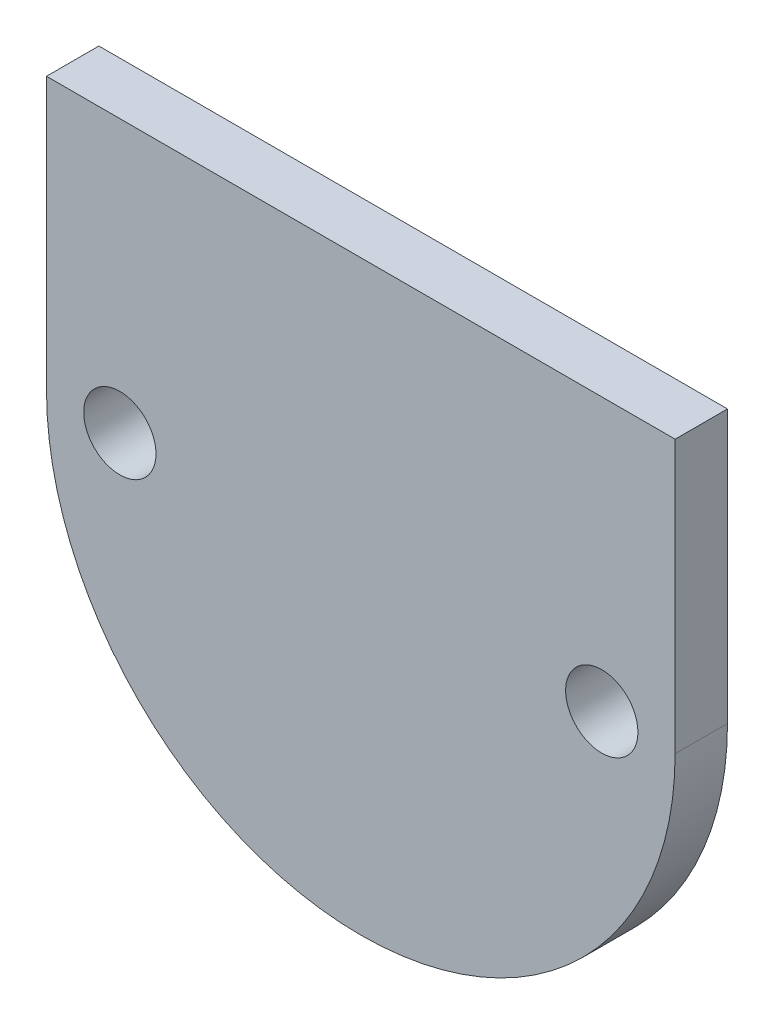
ISO-10303-21;
HEADER;
FILE_DESCRIPTION(('STEP AP214'),'2;1');
FILE_NAME('part.step','',(''),(''),'','','');
FILE_SCHEMA(('AUTOMOTIVE_DESIGN { 1 0 10303 214 1 1 1 1 }'));
ENDSEC;
DATA;
#1=APPLICATION_CONTEXT('core data for automotive mechanical design processes');
#2=APPLICATION_PROTOCOL_DEFINITION('international standard','automotive_design',2000,#1);
#3=PRODUCT_CONTEXT('',#1,'mechanical');
#4=PRODUCT('Part','Part','',(#3));
#5=PRODUCT_RELATED_PRODUCT_CATEGORY('part','',(#4));
#6=PRODUCT_DEFINITION_FORMATION('','',#4);
#7=PRODUCT_DEFINITION_CONTEXT('part definition',#1,'design');
#8=PRODUCT_DEFINITION('design','',#6,#7);
#9=PRODUCT_DEFINITION_SHAPE('','',#8);
#10=(LENGTH_UNIT() NAMED_UNIT(*) SI_UNIT(.MILLI.,.METRE.));
#11=(NAMED_UNIT(*) PLANE_ANGLE_UNIT() SI_UNIT($,.RADIAN.));
#12=(NAMED_UNIT(*) SI_UNIT($,.STERADIAN.) SOLID_ANGLE_UNIT());
#13=UNCERTAINTY_MEASURE_WITH_UNIT(LENGTH_MEASURE(1.E-05),#10,'distance_accuracy_value','');
#14=(GEOMETRIC_REPRESENTATION_CONTEXT(3) GLOBAL_UNCERTAINTY_ASSIGNED_CONTEXT((#13)) GLOBAL_UNIT_ASSIGNED_CONTEXT((#10,
#11,#12)) REPRESENTATION_CONTEXT('',''));
#15=CARTESIAN_POINT('',(0.,0.,0.));
#16=DIRECTION('',(0.,0.,1.));
#17=DIRECTION('',(1.,0.,0.));
#18=AXIS2_PLACEMENT_3D('',#15,#16,#17);
#19=CARTESIAN_POINT('',(-146.475088035676,41.618102884009,616.100036621094));
#20=DIRECTION('',(0.,0.,1.));
#21=DIRECTION('',(1.,0.,0.));
#22=AXIS2_PLACEMENT_3D('',#19,#20,#21);
#23=CYLINDRICAL_SURFACE('',#22,8.);
#24=CARTESIAN_POINT('',(-146.475088035676,41.618102884009,615.100036621094));
#25=DIRECTION('',(0.,0.,-1.));
#26=DIRECTION('',(1.,0.,0.));
#27=AXIS2_PLACEMENT_3D('',#24,#25,#26);
#28=CIRCLE('',#27,8.);
#29=CARTESIAN_POINT('',(-138.475088035676,41.618102884009,615.100036621094));
#30=VERTEX_POINT('',#29);
#31=EDGE_CURVE('E10',#30,#30,#28,.T.);
#32=ORIENTED_EDGE('',*,*,#31,.F.);
#33=EDGE_LOOP('',(#32));
#34=FACE_BOUND('',#33,.T.);
#35=CARTESIAN_POINT('',(-146.475088035676,41.618102884009,617.100036621094));
#36=DIRECTION('',(0.,0.,1.));
#37=DIRECTION('',(1.,0.,0.));
#38=AXIS2_PLACEMENT_3D('',#35,#36,#37);
#39=CIRCLE('',#38,8.);
#40=CARTESIAN_POINT('',(-138.475088035676,41.618102884009,617.100036621094));
#41=VERTEX_POINT('',#40);
#42=EDGE_CURVE('E25',#41,#41,#39,.T.);
#43=ORIENTED_EDGE('',*,*,#42,.F.);
#44=EDGE_LOOP('',(#43));
#45=FACE_BOUND('',#44,.T.);
#46=ADVANCED_FACE('F15',(#34,#45),#23,.T.);
#47=CARTESIAN_POINT('',(-146.475088035676,41.618102884009,615.100036621094));
#48=DIRECTION('',(0.,0.,-1.));
#49=DIRECTION('',(-1.,0.,0.));
#50=AXIS2_PLACEMENT_3D('',#47,#48,#49);
#51=PLANE('',#50);
#52=ORIENTED_EDGE('',*,*,#31,.T.);
#53=EDGE_LOOP('',(#52));
#54=FACE_BOUND('',#53,.T.);
#55=ADVANCED_FACE('F116',(#54),#51,.T.);
#56=CARTESIAN_POINT('',(-157.975088035676,41.2248544872213,622.350000977516));
#57=DIRECTION('',(0.,0.,-1.));
#58=DIRECTION('',(1.,0.,0.));
#59=AXIS2_PLACEMENT_3D('',#56,#57,#58);
#60=CYLINDRICAL_SURFACE('',#59,1.725);
#61=CARTESIAN_POINT('',(-157.975088035676,41.2248544872213,617.100036621094));
#62=DIRECTION('',(0.,0.,1.));
#63=DIRECTION('',(1.,0.,0.));
#64=AXIS2_PLACEMENT_3D('',#61,#62,#63);
#65=CIRCLE('',#64,1.725);
#66=CARTESIAN_POINT('',(-156.250088035676,41.2248544872213,617.100036621094));
#67=VERTEX_POINT('',#66);
#68=EDGE_CURVE('E102',#67,#67,#65,.T.);
#69=ORIENTED_EDGE('',*,*,#68,.F.);
#70=EDGE_LOOP('',(#69));
#71=FACE_BOUND('',#70,.T.);
#72=CARTESIAN_POINT('',(-157.975088035676,41.2248544872213,619.600000977516));
#73=DIRECTION('',(0.,0.,-1.));
#74=DIRECTION('',(1.,0.,0.));
#75=AXIS2_PLACEMENT_3D('',#72,#73,#74);
#76=CIRCLE('',#75,1.725);
#77=CARTESIAN_POINT('',(-156.250088035676,41.2248544872213,619.600000977516));
#78=VERTEX_POINT('',#77);
#79=EDGE_CURVE('E89',#78,#78,#76,.T.);
#80=ORIENTED_EDGE('',*,*,#79,.F.);
#81=EDGE_LOOP('',(#80));
#82=FACE_BOUND('',#81,.T.);
#83=ADVANCED_FACE('F124',(#71,#82),#60,.F.);
#84=CARTESIAN_POINT('',(-134.975088035676,41.2248544872213,623.849990844727));
#85=DIRECTION('',(0.,0.,1.));
#86=DIRECTION('',(1.,0.,0.));
#87=AXIS2_PLACEMENT_3D('',#84,#85,#86);
#88=CYLINDRICAL_SURFACE('',#87,1.725);
#89=CARTESIAN_POINT('',(-134.975088035676,41.2248544872213,617.100036621094));
#90=DIRECTION('',(0.,0.,1.));
#91=DIRECTION('',(1.,0.,0.));
#92=AXIS2_PLACEMENT_3D('',#89,#90,#91);
#93=CIRCLE('',#92,1.725);
#94=CARTESIAN_POINT('',(-133.250088035676,41.2248544872213,617.100036621094));
#95=VERTEX_POINT('',#94);
#96=EDGE_CURVE('E97',#95,#95,#93,.T.);
#97=ORIENTED_EDGE('',*,*,#96,.F.);
#98=EDGE_LOOP('',(#97));
#99=FACE_BOUND('',#98,.T.);
#100=CARTESIAN_POINT('',(-134.975088035676,41.2248544872213,619.600000977516));
#101=DIRECTION('',(0.,0.,-1.));
#102=DIRECTION('',(1.,0.,0.));
#103=AXIS2_PLACEMENT_3D('',#100,#101,#102);
#104=CIRCLE('',#103,1.725);
#105=CARTESIAN_POINT('',(-133.250088035676,41.2248544872213,619.600000977516));
#106=VERTEX_POINT('',#105);
#107=EDGE_CURVE('E87',#106,#106,#104,.T.);
#108=ORIENTED_EDGE('',*,*,#107,.F.);
#109=EDGE_LOOP('',(#108));
#110=FACE_BOUND('',#109,.T.);
#111=ADVANCED_FACE('F131',(#99,#110),#88,.F.);
#112=CARTESIAN_POINT('',(-146.475088035676,41.2248544872213,617.100036621094));
#113=DIRECTION('',(0.,0.,-1.));
#114=DIRECTION('',(1.,0.,0.));
#115=AXIS2_PLACEMENT_3D('',#112,#113,#114);
#116=PLANE('',#115);
#117=ORIENTED_EDGE('',*,*,#42,.T.);
#118=EDGE_LOOP('',(#117));
#119=FACE_BOUND('',#118,.T.);
#120=ORIENTED_EDGE('',*,*,#68,.T.);
#121=EDGE_LOOP('',(#120));
#122=FACE_BOUND('',#121,.T.);
#123=ORIENTED_EDGE('',*,*,#96,.T.);
#124=EDGE_LOOP('',(#123));
#125=FACE_BOUND('',#124,.T.);
#126=DIRECTION('',(-1.,0.,0.));
#127=VECTOR('',#126,1.);
#128=CARTESIAN_POINT('',(-146.475088035676,54.2248544872214,617.100036621094));
#129=LINE('',#128,#127);
#130=CARTESIAN_POINT('',(-131.475088035676,54.2248544872214,617.100036621094));
#131=VERTEX_POINT('',#130);
#132=CARTESIAN_POINT('',(-161.475088035676,54.2248544872214,617.100036621094));
#133=VERTEX_POINT('',#132);
#134=EDGE_CURVE('E34',#131,#133,#129,.T.);
#135=ORIENTED_EDGE('',*,*,#134,.F.);
#136=DIRECTION('',(0.,1.,0.));
#137=VECTOR('',#136,1.);
#138=CARTESIAN_POINT('',(-131.475088035676,44.4748544872213,617.100036621094));
#139=LINE('',#138,#137);
#140=CARTESIAN_POINT('',(-131.475088035676,41.2248544872213,617.100036621094));
#141=VERTEX_POINT('',#140);
#142=EDGE_CURVE('E76',#141,#131,#139,.T.);
#143=ORIENTED_EDGE('',*,*,#142,.F.);
#144=CARTESIAN_POINT('',(-146.475088035676,41.2248544872213,617.100036621094));
#145=DIRECTION('',(0.,0.,1.));
#146=DIRECTION('',(-1.,0.,0.));
#147=AXIS2_PLACEMENT_3D('',#144,#145,#146);
#148=CIRCLE('',#147,15.);
#149=CARTESIAN_POINT('',(-161.475088035676,41.2248544872213,617.100036621094));
#150=VERTEX_POINT('',#149);
#151=EDGE_CURVE('E79',#150,#141,#148,.T.);
#152=ORIENTED_EDGE('',*,*,#151,.F.);
#153=DIRECTION('',(0.,-1.,0.));
#154=VECTOR('',#153,1.);
#155=CARTESIAN_POINT('',(-161.475088035676,44.4748544872213,617.100036621094));
#156=LINE('',#155,#154);
#157=EDGE_CURVE('E66',#133,#150,#156,.T.);
#158=ORIENTED_EDGE('',*,*,#157,.F.);
#159=EDGE_LOOP('',(#135,#143,#152,#158));
#160=FACE_BOUND('',#159,.T.);
#161=ADVANCED_FACE('F113',(#119,#122,#125,#160),#116,.T.);
#162=CARTESIAN_POINT('',(-146.475088035676,41.2248544872213,617.350000977516));
#163=DIRECTION('',(0.,0.,-1.));
#164=DIRECTION('',(-1.,0.,0.));
#165=AXIS2_PLACEMENT_3D('',#162,#163,#164);
#166=CYLINDRICAL_SURFACE('',#165,15.);
#167=ORIENTED_EDGE('',*,*,#151,.T.);
#168=DIRECTION('',(0.,0.,1.));
#169=VECTOR('',#168,1.);
#170=CARTESIAN_POINT('',(-131.475088035676,41.2248544872213,617.350000977516));
#171=LINE('',#170,#169);
#172=CARTESIAN_POINT('',(-131.475088035676,41.2248544872213,619.600000977516));
#173=VERTEX_POINT('',#172);
#174=EDGE_CURVE('E75',#141,#173,#171,.T.);
#175=ORIENTED_EDGE('',*,*,#174,.T.);
#176=CARTESIAN_POINT('',(-146.475088035676,41.2248544872213,619.600000977516));
#177=DIRECTION('',(0.,0.,1.));
#178=DIRECTION('',(-1.,0.,0.));
#179=AXIS2_PLACEMENT_3D('',#176,#177,#178);
#180=CIRCLE('',#179,15.);
#181=CARTESIAN_POINT('',(-161.475088035676,41.2248544872213,619.600000977516));
#182=VERTEX_POINT('',#181);
#183=EDGE_CURVE('E85',#182,#173,#180,.T.);
#184=ORIENTED_EDGE('',*,*,#183,.F.);
#185=DIRECTION('',(0.,0.,-1.));
#186=VECTOR('',#185,1.);
#187=CARTESIAN_POINT('',(-161.475088035676,41.2248544872213,617.350000977516));
#188=LINE('',#187,#186);
#189=EDGE_CURVE('E71',#182,#150,#188,.T.);
#190=ORIENTED_EDGE('',*,*,#189,.T.);
#191=EDGE_LOOP('',(#167,#175,#184,#190));
#192=FACE_BOUND('',#191,.T.);
#193=ADVANCED_FACE('F138',(#192),#166,.T.);
#194=CARTESIAN_POINT('',(-131.475088035676,47.7248544872214,618.600000262261));
#195=DIRECTION('',(-1.,0.,0.));
#196=DIRECTION('',(0.,0.,-1.));
#197=AXIS2_PLACEMENT_3D('',#194,#195,#196);
#198=PLANE('',#197);
#199=ORIENTED_EDGE('',*,*,#142,.T.);
#200=DIRECTION('',(0.,0.,1.));
#201=VECTOR('',#200,1.);
#202=CARTESIAN_POINT('',(-131.475088035676,54.2248544872214,618.600000262261));
#203=LINE('',#202,#201);
#204=CARTESIAN_POINT('',(-131.475088035676,54.2248544872214,619.600000977516));
#205=VERTEX_POINT('',#204);
#206=EDGE_CURVE('E81',#131,#205,#203,.T.);
#207=ORIENTED_EDGE('',*,*,#206,.T.);
#208=DIRECTION('',(0.,1.,0.));
#209=VECTOR('',#208,1.);
#210=CARTESIAN_POINT('',(-131.475088035676,44.4748544872213,619.600000977516));
#211=LINE('',#210,#209);
#212=EDGE_CURVE('E53',#173,#205,#211,.T.);
#213=ORIENTED_EDGE('',*,*,#212,.F.);
#214=ORIENTED_EDGE('',*,*,#174,.F.);
#215=EDGE_LOOP('',(#199,#207,#213,#214));
#216=FACE_BOUND('',#215,.T.);
#217=ADVANCED_FACE('F141',(#216),#198,.F.);
#218=CARTESIAN_POINT('',(-146.475088035676,54.2248544872214,618.600000262261));
#219=DIRECTION('',(0.,-1.,0.));
#220=DIRECTION('',(0.,0.,-1.));
#221=AXIS2_PLACEMENT_3D('',#218,#219,#220);
#222=PLANE('',#221);
#223=ORIENTED_EDGE('',*,*,#134,.T.);
#224=DIRECTION('',(0.,0.,1.));
#225=VECTOR('',#224,1.);
#226=CARTESIAN_POINT('',(-161.475088035676,54.2248544872214,618.600000262261));
#227=LINE('',#226,#225);
#228=CARTESIAN_POINT('',(-161.475088035676,54.2248544872214,619.600000977516));
#229=VERTEX_POINT('',#228);
#230=EDGE_CURVE('E63',#133,#229,#227,.T.);
#231=ORIENTED_EDGE('',*,*,#230,.T.);
#232=DIRECTION('',(-1.,0.,0.));
#233=VECTOR('',#232,1.);
#234=CARTESIAN_POINT('',(-146.475088035676,54.2248544872214,619.600000977516));
#235=LINE('',#234,#233);
#236=EDGE_CURVE('E57',#205,#229,#235,.T.);
#237=ORIENTED_EDGE('',*,*,#236,.F.);
#238=ORIENTED_EDGE('',*,*,#206,.F.);
#239=EDGE_LOOP('',(#223,#231,#237,#238));
#240=FACE_BOUND('',#239,.T.);
#241=ADVANCED_FACE('F64',(#240),#222,.F.);
#242=CARTESIAN_POINT('',(-161.475088035676,47.7248544872214,618.600000262261));
#243=DIRECTION('',(1.,0.,0.));
#244=DIRECTION('',(0.,0.,1.));
#245=AXIS2_PLACEMENT_3D('',#242,#243,#244);
#246=PLANE('',#245);
#247=ORIENTED_EDGE('',*,*,#157,.T.);
#248=ORIENTED_EDGE('',*,*,#189,.F.);
#249=DIRECTION('',(0.,-1.,0.));
#250=VECTOR('',#249,1.);
#251=CARTESIAN_POINT('',(-161.475088035676,44.4748544872213,619.600000977516));
#252=LINE('',#251,#250);
#253=EDGE_CURVE('E19',#229,#182,#252,.T.);
#254=ORIENTED_EDGE('',*,*,#253,.F.);
#255=ORIENTED_EDGE('',*,*,#230,.F.);
#256=EDGE_LOOP('',(#247,#248,#254,#255));
#257=FACE_BOUND('',#256,.T.);
#258=ADVANCED_FACE('F69',(#257),#246,.F.);
#259=CARTESIAN_POINT('',(-146.475088035676,41.2248544872213,619.600000977516));
#260=DIRECTION('',(0.,0.,1.));
#261=DIRECTION('',(1.,0.,0.));
#262=AXIS2_PLACEMENT_3D('',#259,#260,#261);
#263=PLANE('',#262);
#264=ORIENTED_EDGE('',*,*,#79,.T.);
#265=EDGE_LOOP('',(#264));
#266=FACE_BOUND('',#265,.T.);
#267=ORIENTED_EDGE('',*,*,#107,.T.);
#268=EDGE_LOOP('',(#267));
#269=FACE_BOUND('',#268,.T.);
#270=ORIENTED_EDGE('',*,*,#183,.T.);
#271=ORIENTED_EDGE('',*,*,#212,.T.);
#272=ORIENTED_EDGE('',*,*,#236,.T.);
#273=ORIENTED_EDGE('',*,*,#253,.T.);
#274=EDGE_LOOP('',(#270,#271,#272,#273));
#275=FACE_BOUND('',#274,.T.);
#276=ADVANCED_FACE('F17',(#266,#269,#275),#263,.T.);
#277=CLOSED_SHELL('',(#46,#55,#83,#111,#161,#193,#217,#241,#258,#276));
#278=MANIFOLD_SOLID_BREP('B1',#277);
#279=ADVANCED_BREP_SHAPE_REPRESENTATION('',(#18,#278),#14);
#280=SHAPE_DEFINITION_REPRESENTATION(#9,#279);
ENDSEC;
END-ISO-10303-21;
